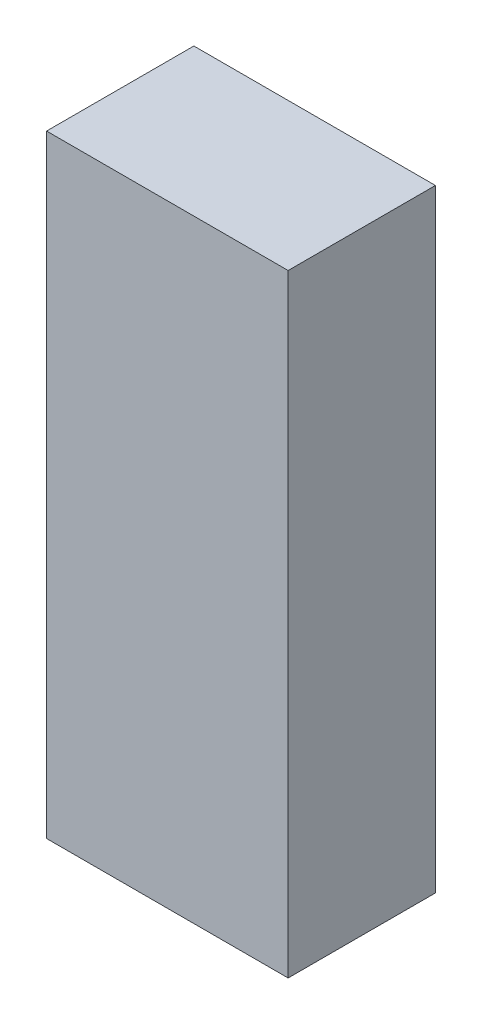
ISO-10303-21;
HEADER;
FILE_DESCRIPTION(('STEP AP214'),'2;1');
FILE_NAME('part.step','',(''),(''),'','','');
FILE_SCHEMA(('AUTOMOTIVE_DESIGN { 1 0 10303 214 1 1 1 1 }'));
ENDSEC;
DATA;
#1=APPLICATION_CONTEXT('core data for automotive mechanical design processes');
#2=APPLICATION_PROTOCOL_DEFINITION('international standard','automotive_design',2000,#1);
#3=PRODUCT_CONTEXT('',#1,'mechanical');
#4=PRODUCT('Part','Part','',(#3));
#5=PRODUCT_RELATED_PRODUCT_CATEGORY('part','',(#4));
#6=PRODUCT_DEFINITION_FORMATION('','',#4);
#7=PRODUCT_DEFINITION_CONTEXT('part definition',#1,'design');
#8=PRODUCT_DEFINITION('design','',#6,#7);
#9=PRODUCT_DEFINITION_SHAPE('','',#8);
#10=(LENGTH_UNIT() NAMED_UNIT(*) SI_UNIT(.MILLI.,.METRE.));
#11=(NAMED_UNIT(*) PLANE_ANGLE_UNIT() SI_UNIT($,.RADIAN.));
#12=(NAMED_UNIT(*) SI_UNIT($,.STERADIAN.) SOLID_ANGLE_UNIT());
#13=UNCERTAINTY_MEASURE_WITH_UNIT(LENGTH_MEASURE(1.E-05),#10,'distance_accuracy_value','');
#14=(GEOMETRIC_REPRESENTATION_CONTEXT(3) GLOBAL_UNCERTAINTY_ASSIGNED_CONTEXT((#13)) GLOBAL_UNIT_ASSIGNED_CONTEXT((#10,
#11,#12)) REPRESENTATION_CONTEXT('',''));
#15=CARTESIAN_POINT('',(0.,0.,0.));
#16=DIRECTION('',(0.,0.,1.));
#17=DIRECTION('',(1.,0.,0.));
#18=AXIS2_PLACEMENT_3D('',#15,#16,#17);
#19=CARTESIAN_POINT('',(-1.025,-2.6,1.25));
#20=DIRECTION('',(0.,1.,0.));
#21=DIRECTION('',(0.,0.,1.));
#22=AXIS2_PLACEMENT_3D('',#19,#20,#21);
#23=PLANE('',#22);
#24=DIRECTION('',(1.,0.,0.));
#25=VECTOR('',#24,1.);
#26=CARTESIAN_POINT('',(-1.025,-2.6,0.));
#27=LINE('',#26,#25);
#28=CARTESIAN_POINT('',(-1.025,-2.6,0.));
#29=VERTEX_POINT('',#28);
#30=CARTESIAN_POINT('',(1.025,-2.6,0.));
#31=VERTEX_POINT('',#30);
#32=EDGE_CURVE('E97',#29,#31,#27,.T.);
#33=ORIENTED_EDGE('',*,*,#32,.T.);
#34=DIRECTION('',(0.,0.,-1.));
#35=VECTOR('',#34,1.);
#36=CARTESIAN_POINT('',(1.025,-2.6,1.25));
#37=LINE('',#36,#35);
#38=CARTESIAN_POINT('',(1.025,-2.6,1.25));
#39=VERTEX_POINT('',#38);
#40=EDGE_CURVE('E11',#39,#31,#37,.T.);
#41=ORIENTED_EDGE('',*,*,#40,.F.);
#42=DIRECTION('',(1.,0.,0.));
#43=VECTOR('',#42,1.);
#44=CARTESIAN_POINT('',(-1.025,-2.6,1.25));
#45=LINE('',#44,#43);
#46=CARTESIAN_POINT('',(-1.025,-2.6,1.25));
#47=VERTEX_POINT('',#46);
#48=EDGE_CURVE('E85',#47,#39,#45,.T.);
#49=ORIENTED_EDGE('',*,*,#48,.F.);
#50=DIRECTION('',(0.,0.,-1.));
#51=VECTOR('',#50,1.);
#52=CARTESIAN_POINT('',(-1.025,-2.6,1.25));
#53=LINE('',#52,#51);
#54=EDGE_CURVE('E93',#47,#29,#53,.T.);
#55=ORIENTED_EDGE('',*,*,#54,.T.);
#56=EDGE_LOOP('',(#33,#41,#49,#55));
#57=FACE_BOUND('',#56,.T.);
#58=ADVANCED_FACE('F34',(#57),#23,.F.);
#59=CARTESIAN_POINT('',(1.025,-2.6,1.25));
#60=DIRECTION('',(-1.,0.,0.));
#61=DIRECTION('',(0.,0.,1.));
#62=AXIS2_PLACEMENT_3D('',#59,#60,#61);
#63=PLANE('',#62);
#64=DIRECTION('',(0.,1.,0.));
#65=VECTOR('',#64,1.);
#66=CARTESIAN_POINT('',(1.025,-2.6,0.));
#67=LINE('',#66,#65);
#68=CARTESIAN_POINT('',(1.025,2.6,0.));
#69=VERTEX_POINT('',#68);
#70=EDGE_CURVE('E89',#31,#69,#67,.T.);
#71=ORIENTED_EDGE('',*,*,#70,.T.);
#72=DIRECTION('',(0.,0.,-1.));
#73=VECTOR('',#72,1.);
#74=CARTESIAN_POINT('',(1.025,2.6,1.25));
#75=LINE('',#74,#73);
#76=CARTESIAN_POINT('',(1.025,2.6,1.25));
#77=VERTEX_POINT('',#76);
#78=EDGE_CURVE('E42',#77,#69,#75,.T.);
#79=ORIENTED_EDGE('',*,*,#78,.F.);
#80=DIRECTION('',(0.,1.,0.));
#81=VECTOR('',#80,1.);
#82=CARTESIAN_POINT('',(1.025,-2.6,1.25));
#83=LINE('',#82,#81);
#84=EDGE_CURVE('E80',#39,#77,#83,.T.);
#85=ORIENTED_EDGE('',*,*,#84,.F.);
#86=ORIENTED_EDGE('',*,*,#40,.T.);
#87=EDGE_LOOP('',(#71,#79,#85,#86));
#88=FACE_BOUND('',#87,.T.);
#89=ADVANCED_FACE('F88',(#88),#63,.F.);
#90=CARTESIAN_POINT('',(1.025,2.6,1.25));
#91=DIRECTION('',(0.,-1.,0.));
#92=DIRECTION('',(0.,0.,-1.));
#93=AXIS2_PLACEMENT_3D('',#90,#91,#92);
#94=PLANE('',#93);
#95=DIRECTION('',(-1.,0.,0.));
#96=VECTOR('',#95,1.);
#97=CARTESIAN_POINT('',(1.025,2.6,0.));
#98=LINE('',#97,#96);
#99=CARTESIAN_POINT('',(-1.025,2.6,0.));
#100=VERTEX_POINT('',#99);
#101=EDGE_CURVE('E67',#69,#100,#98,.T.);
#102=ORIENTED_EDGE('',*,*,#101,.T.);
#103=DIRECTION('',(0.,0.,-1.));
#104=VECTOR('',#103,1.);
#105=CARTESIAN_POINT('',(-1.025,2.6,1.25));
#106=LINE('',#105,#104);
#107=CARTESIAN_POINT('',(-1.025,2.6,1.25));
#108=VERTEX_POINT('',#107);
#109=EDGE_CURVE('E90',#108,#100,#106,.T.);
#110=ORIENTED_EDGE('',*,*,#109,.F.);
#111=DIRECTION('',(-1.,0.,0.));
#112=VECTOR('',#111,1.);
#113=CARTESIAN_POINT('',(1.025,2.6,1.25));
#114=LINE('',#113,#112);
#115=EDGE_CURVE('E83',#77,#108,#114,.T.);
#116=ORIENTED_EDGE('',*,*,#115,.F.);
#117=ORIENTED_EDGE('',*,*,#78,.T.);
#118=EDGE_LOOP('',(#102,#110,#116,#117));
#119=FACE_BOUND('',#118,.T.);
#120=ADVANCED_FACE('F91',(#119),#94,.F.);
#121=CARTESIAN_POINT('',(-1.025,2.6,1.25));
#122=DIRECTION('',(1.,0.,0.));
#123=DIRECTION('',(0.,0.,-1.));
#124=AXIS2_PLACEMENT_3D('',#121,#122,#123);
#125=PLANE('',#124);
#126=DIRECTION('',(0.,-1.,0.));
#127=VECTOR('',#126,1.);
#128=CARTESIAN_POINT('',(-1.025,2.6,0.));
#129=LINE('',#128,#127);
#130=EDGE_CURVE('E73',#100,#29,#129,.T.);
#131=ORIENTED_EDGE('',*,*,#130,.T.);
#132=ORIENTED_EDGE('',*,*,#54,.F.);
#133=DIRECTION('',(0.,-1.,0.));
#134=VECTOR('',#133,1.);
#135=CARTESIAN_POINT('',(-1.025,2.6,1.25));
#136=LINE('',#135,#134);
#137=EDGE_CURVE('E50',#108,#47,#136,.T.);
#138=ORIENTED_EDGE('',*,*,#137,.F.);
#139=ORIENTED_EDGE('',*,*,#109,.T.);
#140=EDGE_LOOP('',(#131,#132,#138,#139));
#141=FACE_BOUND('',#140,.T.);
#142=ADVANCED_FACE('F104',(#141),#125,.F.);
#143=CARTESIAN_POINT('',(0.,0.,1.25));
#144=DIRECTION('',(0.,0.,1.));
#145=DIRECTION('',(1.,0.,0.));
#146=AXIS2_PLACEMENT_3D('',#143,#144,#145);
#147=PLANE('',#146);
#148=ORIENTED_EDGE('',*,*,#48,.T.);
#149=ORIENTED_EDGE('',*,*,#84,.T.);
#150=ORIENTED_EDGE('',*,*,#115,.T.);
#151=ORIENTED_EDGE('',*,*,#137,.T.);
#152=EDGE_LOOP('',(#148,#149,#150,#151));
#153=FACE_BOUND('',#152,.T.);
#154=ADVANCED_FACE('F81',(#153),#147,.T.);
#155=CARTESIAN_POINT('',(0.,0.,0.));
#156=DIRECTION('',(0.,0.,1.));
#157=DIRECTION('',(1.,0.,0.));
#158=AXIS2_PLACEMENT_3D('',#155,#156,#157);
#159=PLANE('',#158);
#160=ORIENTED_EDGE('',*,*,#32,.F.);
#161=ORIENTED_EDGE('',*,*,#130,.F.);
#162=ORIENTED_EDGE('',*,*,#101,.F.);
#163=ORIENTED_EDGE('',*,*,#70,.F.);
#164=EDGE_LOOP('',(#160,#161,#162,#163));
#165=FACE_BOUND('',#164,.T.);
#166=ADVANCED_FACE('F107',(#165),#159,.F.);
#167=CLOSED_SHELL('',(#58,#89,#120,#142,#154,#166));
#168=MANIFOLD_SOLID_BREP('B2',#167);
#169=ADVANCED_BREP_SHAPE_REPRESENTATION('',(#18,#168),#14);
#170=SHAPE_DEFINITION_REPRESENTATION(#9,#169);
ENDSEC;
END-ISO-10303-21;
